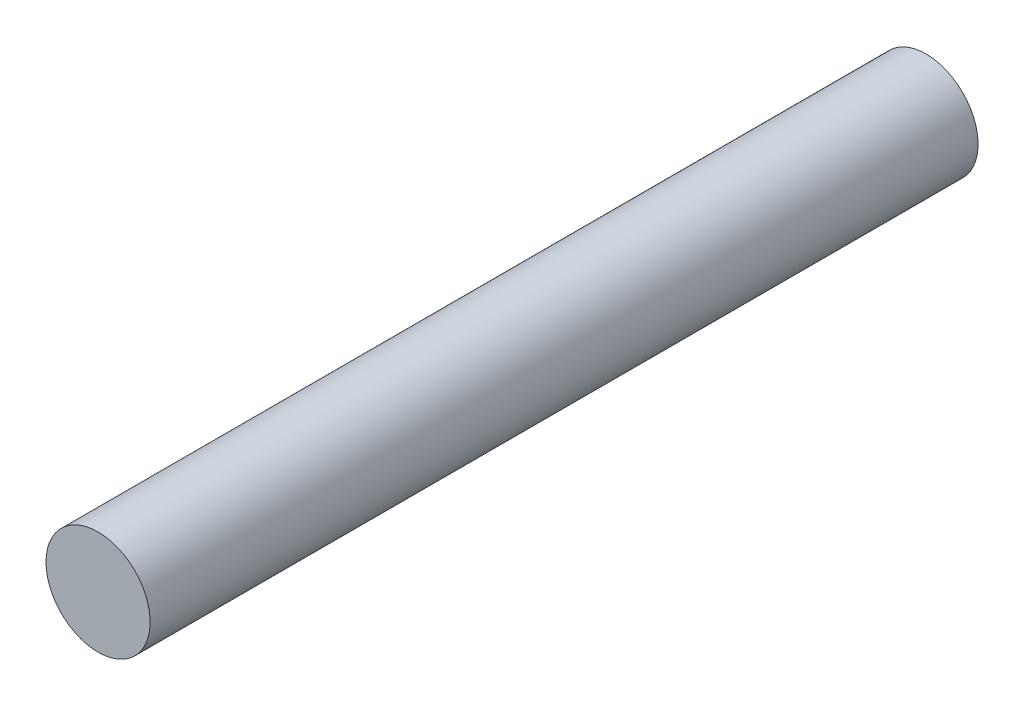
ISO-10303-21;
HEADER;
FILE_DESCRIPTION(('STEP AP214'),'2;1');
FILE_NAME('part.step','',(''),(''),'','','');
FILE_SCHEMA(('AUTOMOTIVE_DESIGN { 1 0 10303 214 1 1 1 1 }'));
ENDSEC;
DATA;
#1=APPLICATION_CONTEXT('core data for automotive mechanical design processes');
#2=APPLICATION_PROTOCOL_DEFINITION('international standard','automotive_design',2000,#1);
#3=PRODUCT_CONTEXT('',#1,'mechanical');
#4=PRODUCT('Part','Part','',(#3));
#5=PRODUCT_RELATED_PRODUCT_CATEGORY('part','',(#4));
#6=PRODUCT_DEFINITION_FORMATION('','',#4);
#7=PRODUCT_DEFINITION_CONTEXT('part definition',#1,'design');
#8=PRODUCT_DEFINITION('design','',#6,#7);
#9=PRODUCT_DEFINITION_SHAPE('','',#8);
#10=(LENGTH_UNIT() NAMED_UNIT(*) SI_UNIT(.MILLI.,.METRE.));
#11=(NAMED_UNIT(*) PLANE_ANGLE_UNIT() SI_UNIT($,.RADIAN.));
#12=(NAMED_UNIT(*) SI_UNIT($,.STERADIAN.) SOLID_ANGLE_UNIT());
#13=UNCERTAINTY_MEASURE_WITH_UNIT(LENGTH_MEASURE(1.E-05),#10,'distance_accuracy_value','');
#14=(GEOMETRIC_REPRESENTATION_CONTEXT(3) GLOBAL_UNCERTAINTY_ASSIGNED_CONTEXT((#13)) GLOBAL_UNIT_ASSIGNED_CONTEXT((#10,
#11,#12)) REPRESENTATION_CONTEXT('',''));
#15=CARTESIAN_POINT('',(0.,0.,0.));
#16=DIRECTION('',(0.,0.,1.));
#17=DIRECTION('',(1.,0.,0.));
#18=AXIS2_PLACEMENT_3D('',#15,#16,#17);
#19=CARTESIAN_POINT('',(0.,0.,159.));
#20=DIRECTION('',(0.,0.,-1.));
#21=DIRECTION('',(-1.,0.,0.));
#22=AXIS2_PLACEMENT_3D('',#19,#20,#21);
#23=CYLINDRICAL_SURFACE('',#22,10.);
#24=CARTESIAN_POINT('',(0.,0.,159.));
#25=DIRECTION('',(0.,0.,1.));
#26=DIRECTION('',(1.,0.,0.));
#27=AXIS2_PLACEMENT_3D('',#24,#25,#26);
#28=CIRCLE('',#27,10.);
#29=CARTESIAN_POINT('',(-10.,0.,159.));
#30=VERTEX_POINT('',#29);
#31=EDGE_CURVE('E10',#30,#30,#28,.T.);
#32=CARTESIAN_POINT('',(0.,0.,0.));
#33=DIRECTION('',(0.,0.,1.));
#34=DIRECTION('',(1.,0.,0.));
#35=AXIS2_PLACEMENT_3D('',#32,#33,#34);
#36=CIRCLE('',#35,10.);
#37=CARTESIAN_POINT('',(-10.,0.,0.));
#38=VERTEX_POINT('',#37);
#39=EDGE_CURVE('E34',#38,#38,#36,.T.);
#40=CARTESIAN_POINT('',(-10.,0.,159.));
#41=CARTESIAN_POINT('',(-10.,0.,157.34375));
#42=CARTESIAN_POINT('',(-10.,0.,155.6875));
#43=CARTESIAN_POINT('',(-10.,0.,152.375));
#44=CARTESIAN_POINT('',(-10.,0.,150.71875));
#45=CARTESIAN_POINT('',(-10.,0.,147.40625));
#46=CARTESIAN_POINT('',(-10.,0.,145.75));
#47=CARTESIAN_POINT('',(-10.,0.,142.4375));
#48=CARTESIAN_POINT('',(-10.,0.,140.78125));
#49=CARTESIAN_POINT('',(-10.,0.,137.46875));
#50=CARTESIAN_POINT('',(-10.,0.,135.8125));
#51=CARTESIAN_POINT('',(-10.,0.,132.5));
#52=CARTESIAN_POINT('',(-10.,0.,130.84375));
#53=CARTESIAN_POINT('',(-10.,0.,127.53125));
#54=CARTESIAN_POINT('',(-10.,0.,125.875));
#55=CARTESIAN_POINT('',(-10.,0.,122.5625));
#56=CARTESIAN_POINT('',(-10.,0.,120.90625));
#57=CARTESIAN_POINT('',(-10.,0.,117.59375));
#58=CARTESIAN_POINT('',(-10.,0.,115.9375));
#59=CARTESIAN_POINT('',(-10.,0.,112.625));
#60=CARTESIAN_POINT('',(-10.,0.,110.96875));
#61=CARTESIAN_POINT('',(-10.,0.,107.65625));
#62=CARTESIAN_POINT('',(-10.,0.,106.));
#63=CARTESIAN_POINT('',(-10.,0.,102.6875));
#64=CARTESIAN_POINT('',(-10.,0.,101.03125));
#65=CARTESIAN_POINT('',(-10.,0.,97.71875));
#66=CARTESIAN_POINT('',(-10.,0.,96.0625));
#67=CARTESIAN_POINT('',(-10.,0.,92.75));
#68=CARTESIAN_POINT('',(-10.,0.,91.09375));
#69=CARTESIAN_POINT('',(-10.,0.,87.78125));
#70=CARTESIAN_POINT('',(-10.,0.,86.125));
#71=CARTESIAN_POINT('',(-10.,0.,82.8125));
#72=CARTESIAN_POINT('',(-10.,0.,81.15625));
#73=CARTESIAN_POINT('',(-10.,0.,77.84375));
#74=CARTESIAN_POINT('',(-10.,0.,76.1875));
#75=CARTESIAN_POINT('',(-10.,0.,72.875));
#76=CARTESIAN_POINT('',(-10.,0.,71.21875));
#77=CARTESIAN_POINT('',(-10.,0.,67.90625));
#78=CARTESIAN_POINT('',(-10.,0.,66.25));
#79=CARTESIAN_POINT('',(-10.,0.,62.9375));
#80=CARTESIAN_POINT('',(-10.,0.,61.28125));
#81=CARTESIAN_POINT('',(-10.,0.,57.96875));
#82=CARTESIAN_POINT('',(-10.,0.,56.3125));
#83=CARTESIAN_POINT('',(-10.,0.,53.));
#84=CARTESIAN_POINT('',(-10.,0.,51.34375));
#85=CARTESIAN_POINT('',(-10.,0.,48.03125));
#86=CARTESIAN_POINT('',(-10.,0.,46.375));
#87=CARTESIAN_POINT('',(-10.,0.,43.0625));
#88=CARTESIAN_POINT('',(-10.,0.,41.40625));
#89=CARTESIAN_POINT('',(-10.,0.,38.09375));
#90=CARTESIAN_POINT('',(-10.,0.,36.4375));
#91=CARTESIAN_POINT('',(-10.,0.,33.125));
#92=CARTESIAN_POINT('',(-10.,0.,31.46875));
#93=CARTESIAN_POINT('',(-10.,0.,28.15625));
#94=CARTESIAN_POINT('',(-10.,0.,26.5));
#95=CARTESIAN_POINT('',(-10.,0.,23.1875));
#96=CARTESIAN_POINT('',(-10.,0.,21.53125));
#97=CARTESIAN_POINT('',(-10.,0.,18.21875));
#98=CARTESIAN_POINT('',(-10.,0.,16.5625));
#99=CARTESIAN_POINT('',(-10.,0.,13.25));
#100=CARTESIAN_POINT('',(-10.,0.,11.59375));
#101=CARTESIAN_POINT('',(-10.,0.,8.28124999999999));
#102=CARTESIAN_POINT('',(-10.,0.,6.62499999999999));
#103=CARTESIAN_POINT('',(-10.,0.,3.3125));
#104=CARTESIAN_POINT('',(-10.,0.,1.65625));
#105=CARTESIAN_POINT('',(-10.,0.,0.));
#106=B_SPLINE_CURVE_WITH_KNOTS('',3,(#40,#41,#42,#43,#44,#45,#46,#47,#48,#49,#50,#51,#52,#53,
#54,#55,#56,#57,#58,#59,#60,#61,#62,#63,#64,#65,#66,#67,#68,#69,#70,#71,#72,#73,#74,#75,#76,#77,
#78,#79,#80,#81,#82,#83,#84,#85,#86,#87,#88,#89,#90,#91,#92,#93,#94,#95,#96,#97,#98,#99,#100,
#101,#102,#103,#104,#105),.UNSPECIFIED.,.F.,.F.,(4,2,2,2,2,2,2,2,2,2,2,2,2,2,2,2,2,2,2,2,2,2,2,
2,2,2,2,2,2,2,2,2,4),(0.,4.96875000000002,9.93750000000002,14.90625,19.875,24.84375,29.8125,
34.78125,39.75,44.71875,49.6875,54.65625,59.625,64.59375,69.5625,74.53125,79.5,84.46875,89.4375,
94.40625,99.375,104.34375,109.3125,114.28125,119.25,124.21875,129.1875,134.15625,139.125,
144.09375,149.0625,154.03125,159.),.UNSPECIFIED.);
#107=EDGE_CURVE('BSEAM31',#30,#38,#106,.T.);
#108=ORIENTED_EDGE('',*,*,#31,.F.);
#109=ORIENTED_EDGE('',*,*,#39,.T.);
#110=ORIENTED_EDGE('',*,*,#107,.T.);
#111=ORIENTED_EDGE('',*,*,#107,.F.);
#112=EDGE_LOOP('',(#108,#110,#109,#111));
#113=FACE_BOUND('',#112,.T.);
#114=ADVANCED_FACE('F31',(#113),#23,.T.);
#115=CARTESIAN_POINT('',(0.,0.,159.));
#116=DIRECTION('',(0.,0.,1.));
#117=DIRECTION('',(1.,0.,0.));
#118=AXIS2_PLACEMENT_3D('',#115,#116,#117);
#119=PLANE('',#118);
#120=ORIENTED_EDGE('',*,*,#31,.T.);
#121=EDGE_LOOP('',(#120));
#122=FACE_BOUND('',#121,.T.);
#123=ADVANCED_FACE('F46',(#122),#119,.T.);
#124=CARTESIAN_POINT('',(0.,0.,0.));
#125=DIRECTION('',(0.,0.,1.));
#126=DIRECTION('',(1.,0.,0.));
#127=AXIS2_PLACEMENT_3D('',#124,#125,#126);
#128=PLANE('',#127);
#129=ORIENTED_EDGE('',*,*,#39,.F.);
#130=EDGE_LOOP('',(#129));
#131=FACE_BOUND('',#130,.T.);
#132=ADVANCED_FACE('F44',(#131),#128,.F.);
#133=CLOSED_SHELL('',(#114,#123,#132));
#134=MANIFOLD_SOLID_BREP('B2',#133);
#135=ADVANCED_BREP_SHAPE_REPRESENTATION('',(#18,#134),#14);
#136=SHAPE_DEFINITION_REPRESENTATION(#9,#135);
ENDSEC;
END-ISO-10303-21;
